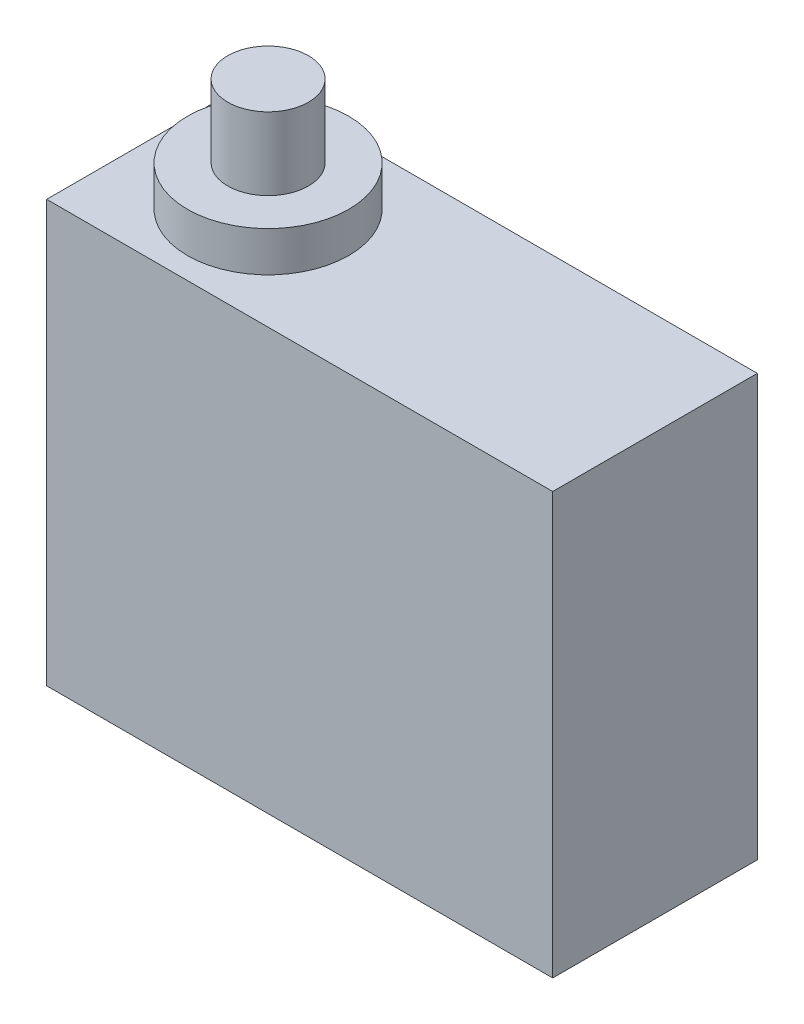
ISO-10303-21;
HEADER;
FILE_DESCRIPTION(('STEP AP214'),'2;1');
FILE_NAME('part.step','',(''),(''),'','','');
FILE_SCHEMA(('AUTOMOTIVE_DESIGN { 1 0 10303 214 1 1 1 1 }'));
ENDSEC;
DATA;
#1=APPLICATION_CONTEXT('core data for automotive mechanical design processes');
#2=APPLICATION_PROTOCOL_DEFINITION('international standard','automotive_design',2000,#1);
#3=PRODUCT_CONTEXT('',#1,'mechanical');
#4=PRODUCT('Part','Part','',(#3));
#5=PRODUCT_RELATED_PRODUCT_CATEGORY('part','',(#4));
#6=PRODUCT_DEFINITION_FORMATION('','',#4);
#7=PRODUCT_DEFINITION_CONTEXT('part definition',#1,'design');
#8=PRODUCT_DEFINITION('design','',#6,#7);
#9=PRODUCT_DEFINITION_SHAPE('','',#8);
#10=(LENGTH_UNIT() NAMED_UNIT(*) SI_UNIT(.MILLI.,.METRE.));
#11=(NAMED_UNIT(*) PLANE_ANGLE_UNIT() SI_UNIT($,.RADIAN.));
#12=(NAMED_UNIT(*) SI_UNIT($,.STERADIAN.) SOLID_ANGLE_UNIT());
#13=UNCERTAINTY_MEASURE_WITH_UNIT(LENGTH_MEASURE(1.E-05),#10,'distance_accuracy_value','');
#14=(GEOMETRIC_REPRESENTATION_CONTEXT(3) GLOBAL_UNCERTAINTY_ASSIGNED_CONTEXT((#13)) GLOBAL_UNIT_ASSIGNED_CONTEXT((#10,
#11,#12)) REPRESENTATION_CONTEXT('',''));
#15=CARTESIAN_POINT('',(0.,0.,0.));
#16=DIRECTION('',(0.,0.,1.));
#17=DIRECTION('',(1.,0.,0.));
#18=AXIS2_PLACEMENT_3D('',#15,#16,#17);
#19=CARTESIAN_POINT('',(-9.41,-7.835,3.805));
#20=DIRECTION('',(1.,0.,0.));
#21=DIRECTION('',(0.,0.,-1.));
#22=AXIS2_PLACEMENT_3D('',#19,#20,#21);
#23=PLANE('',#22);
#24=DIRECTION('',(0.,-1.,0.));
#25=VECTOR('',#24,1.);
#26=CARTESIAN_POINT('',(-9.41,-7.835,-3.805));
#27=LINE('',#26,#25);
#28=CARTESIAN_POINT('',(-9.41,7.835,-3.805));
#29=VERTEX_POINT('',#28);
#30=CARTESIAN_POINT('',(-9.41,-7.835,-3.805));
#31=VERTEX_POINT('',#30);
#32=EDGE_CURVE('E112',#29,#31,#27,.T.);
#33=ORIENTED_EDGE('',*,*,#32,.T.);
#34=DIRECTION('',(0.,0.,-1.));
#35=VECTOR('',#34,1.);
#36=CARTESIAN_POINT('',(-9.41,-7.835,3.805));
#37=LINE('',#36,#35);
#38=CARTESIAN_POINT('',(-9.41,-7.835,3.805));
#39=VERTEX_POINT('',#38);
#40=EDGE_CURVE('E101',#39,#31,#37,.T.);
#41=ORIENTED_EDGE('',*,*,#40,.F.);
#42=DIRECTION('',(0.,-1.,0.));
#43=VECTOR('',#42,1.);
#44=CARTESIAN_POINT('',(-9.41,-7.835,3.805));
#45=LINE('',#44,#43);
#46=CARTESIAN_POINT('',(-9.41,7.835,3.805));
#47=VERTEX_POINT('',#46);
#48=EDGE_CURVE('E93',#47,#39,#45,.T.);
#49=ORIENTED_EDGE('',*,*,#48,.F.);
#50=DIRECTION('',(0.,0.,-1.));
#51=VECTOR('',#50,1.);
#52=CARTESIAN_POINT('',(-9.41,7.835,3.805));
#53=LINE('',#52,#51);
#54=EDGE_CURVE('E108',#47,#29,#53,.T.);
#55=ORIENTED_EDGE('',*,*,#54,.T.);
#56=EDGE_LOOP('',(#33,#41,#49,#55));
#57=FACE_BOUND('',#56,.T.);
#58=ADVANCED_FACE('F39',(#57),#23,.F.);
#59=CARTESIAN_POINT('',(9.41,-7.83499999999999,3.805));
#60=DIRECTION('',(0.,1.,0.));
#61=DIRECTION('',(-1.,0.,0.));
#62=AXIS2_PLACEMENT_3D('',#59,#60,#61);
#63=PLANE('',#62);
#64=DIRECTION('',(1.,0.,0.));
#65=VECTOR('',#64,1.);
#66=CARTESIAN_POINT('',(9.41,-7.83499999999999,-3.805));
#67=LINE('',#66,#65);
#68=CARTESIAN_POINT('',(9.41,-7.83499999999999,-3.805));
#69=VERTEX_POINT('',#68);
#70=EDGE_CURVE('E99',#31,#69,#67,.T.);
#71=ORIENTED_EDGE('',*,*,#70,.T.);
#72=DIRECTION('',(0.,0.,-1.));
#73=VECTOR('',#72,1.);
#74=CARTESIAN_POINT('',(9.41,-7.83499999999999,3.805));
#75=LINE('',#74,#73);
#76=CARTESIAN_POINT('',(9.41,-7.83499999999999,3.805));
#77=VERTEX_POINT('',#76);
#78=EDGE_CURVE('E97',#77,#69,#75,.T.);
#79=ORIENTED_EDGE('',*,*,#78,.F.);
#80=DIRECTION('',(1.,0.,0.));
#81=VECTOR('',#80,1.);
#82=CARTESIAN_POINT('',(9.41,-7.83499999999999,3.805));
#83=LINE('',#82,#81);
#84=EDGE_CURVE('E88',#39,#77,#83,.T.);
#85=ORIENTED_EDGE('',*,*,#84,.F.);
#86=ORIENTED_EDGE('',*,*,#40,.T.);
#87=EDGE_LOOP('',(#71,#79,#85,#86));
#88=FACE_BOUND('',#87,.T.);
#89=ADVANCED_FACE('F98',(#88),#63,.F.);
#90=CARTESIAN_POINT('',(9.41,-7.83499999999999,3.805));
#91=DIRECTION('',(-1.,0.,0.));
#92=DIRECTION('',(0.,0.,1.));
#93=AXIS2_PLACEMENT_3D('',#90,#91,#92);
#94=PLANE('',#93);
#95=DIRECTION('',(0.,1.,0.));
#96=VECTOR('',#95,1.);
#97=CARTESIAN_POINT('',(9.41,-7.83499999999999,-3.805));
#98=LINE('',#97,#96);
#99=CARTESIAN_POINT('',(9.41,7.83500000000001,-3.805));
#100=VERTEX_POINT('',#99);
#101=EDGE_CURVE('E74',#69,#100,#98,.T.);
#102=ORIENTED_EDGE('',*,*,#101,.T.);
#103=DIRECTION('',(0.,0.,-1.));
#104=VECTOR('',#103,1.);
#105=CARTESIAN_POINT('',(9.41,7.83500000000001,3.805));
#106=LINE('',#105,#104);
#107=CARTESIAN_POINT('',(9.41,7.83500000000001,3.805));
#108=VERTEX_POINT('',#107);
#109=EDGE_CURVE('E102',#108,#100,#106,.T.);
#110=ORIENTED_EDGE('',*,*,#109,.F.);
#111=DIRECTION('',(0.,1.,0.));
#112=VECTOR('',#111,1.);
#113=CARTESIAN_POINT('',(9.41,-7.83499999999999,3.805));
#114=LINE('',#113,#112);
#115=EDGE_CURVE('E91',#77,#108,#114,.T.);
#116=ORIENTED_EDGE('',*,*,#115,.F.);
#117=ORIENTED_EDGE('',*,*,#78,.T.);
#118=EDGE_LOOP('',(#102,#110,#116,#117));
#119=FACE_BOUND('',#118,.T.);
#120=ADVANCED_FACE('F104',(#119),#94,.F.);
#121=CARTESIAN_POINT('',(9.41,7.83500000000001,3.805));
#122=DIRECTION('',(0.,-1.,0.));
#123=DIRECTION('',(1.,0.,0.));
#124=AXIS2_PLACEMENT_3D('',#121,#122,#123);
#125=PLANE('',#124);
#126=CARTESIAN_POINT('',(-4.98,7.835,0.));
#127=DIRECTION('',(0.,-1.,0.));
#128=DIRECTION('',(1.,0.,0.));
#129=AXIS2_PLACEMENT_3D('',#126,#127,#128);
#130=CIRCLE('',#129,3.);
#131=CARTESIAN_POINT('',(-1.98,7.835,0.));
#132=VERTEX_POINT('',#131);
#133=EDGE_CURVE('E42',#132,#132,#130,.F.);
#134=ORIENTED_EDGE('',*,*,#133,.F.);
#135=EDGE_LOOP('',(#134));
#136=FACE_BOUND('',#135,.T.);
#137=DIRECTION('',(-1.,0.,0.));
#138=VECTOR('',#137,1.);
#139=CARTESIAN_POINT('',(9.41,7.83500000000001,-3.805));
#140=LINE('',#139,#138);
#141=EDGE_CURVE('E80',#100,#29,#140,.T.);
#142=ORIENTED_EDGE('',*,*,#141,.T.);
#143=ORIENTED_EDGE('',*,*,#54,.F.);
#144=DIRECTION('',(-1.,0.,0.));
#145=VECTOR('',#144,1.);
#146=CARTESIAN_POINT('',(9.41,7.83500000000001,3.805));
#147=LINE('',#146,#145);
#148=EDGE_CURVE('E57',#108,#47,#147,.T.);
#149=ORIENTED_EDGE('',*,*,#148,.F.);
#150=ORIENTED_EDGE('',*,*,#109,.T.);
#151=EDGE_LOOP('',(#142,#143,#149,#150));
#152=FACE_BOUND('',#151,.T.);
#153=ADVANCED_FACE('F133',(#136,#152),#125,.F.);
#154=CARTESIAN_POINT('',(0.,0.,3.805));
#155=DIRECTION('',(0.,0.,1.));
#156=DIRECTION('',(1.,0.,0.));
#157=AXIS2_PLACEMENT_3D('',#154,#155,#156);
#158=PLANE('',#157);
#159=ORIENTED_EDGE('',*,*,#48,.T.);
#160=ORIENTED_EDGE('',*,*,#84,.T.);
#161=ORIENTED_EDGE('',*,*,#115,.T.);
#162=ORIENTED_EDGE('',*,*,#148,.T.);
#163=EDGE_LOOP('',(#159,#160,#161,#162));
#164=FACE_BOUND('',#163,.T.);
#165=ADVANCED_FACE('F89',(#164),#158,.T.);
#166=CARTESIAN_POINT('',(0.,0.,-3.805));
#167=DIRECTION('',(0.,0.,1.));
#168=DIRECTION('',(1.,0.,0.));
#169=AXIS2_PLACEMENT_3D('',#166,#167,#168);
#170=PLANE('',#169);
#171=ORIENTED_EDGE('',*,*,#32,.F.);
#172=ORIENTED_EDGE('',*,*,#141,.F.);
#173=ORIENTED_EDGE('',*,*,#101,.F.);
#174=ORIENTED_EDGE('',*,*,#70,.F.);
#175=EDGE_LOOP('',(#171,#172,#173,#174));
#176=FACE_BOUND('',#175,.T.);
#177=ADVANCED_FACE('F140',(#176),#170,.F.);
#178=CARTESIAN_POINT('',(-4.98,9.325,0.));
#179=DIRECTION('',(0.,-1.,0.));
#180=DIRECTION('',(1.,0.,0.));
#181=AXIS2_PLACEMENT_3D('',#178,#179,#180);
#182=CYLINDRICAL_SURFACE('',#181,3.);
#183=CARTESIAN_POINT('',(-4.98,9.325,0.));
#184=DIRECTION('',(0.,1.,0.));
#185=DIRECTION('',(-1.,0.,0.));
#186=AXIS2_PLACEMENT_3D('',#183,#184,#185);
#187=CIRCLE('',#186,3.);
#188=CARTESIAN_POINT('',(-7.98,9.325,0.));
#189=VERTEX_POINT('',#188);
#190=EDGE_CURVE('E116',#189,#189,#187,.T.);
#191=ORIENTED_EDGE('',*,*,#190,.F.);
#192=EDGE_LOOP('',(#191));
#193=FACE_BOUND('',#192,.T.);
#194=ORIENTED_EDGE('',*,*,#133,.T.);
#195=EDGE_LOOP('',(#194));
#196=FACE_BOUND('',#195,.T.);
#197=ADVANCED_FACE('F131',(#193,#196),#182,.T.);
#198=CARTESIAN_POINT('',(-4.98,9.325,0.));
#199=DIRECTION('',(0.,1.,0.));
#200=DIRECTION('',(-1.,0.,0.));
#201=AXIS2_PLACEMENT_3D('',#198,#199,#200);
#202=PLANE('',#201);
#203=CARTESIAN_POINT('',(-4.98,9.325,0.));
#204=DIRECTION('',(0.,1.,0.));
#205=DIRECTION('',(-1.,0.,0.));
#206=AXIS2_PLACEMENT_3D('',#203,#204,#205);
#207=CIRCLE('',#206,1.5);
#208=CARTESIAN_POINT('',(-3.48,9.325,0.));
#209=VERTEX_POINT('',#208);
#210=EDGE_CURVE('E11',#209,#209,#207,.T.);
#211=ORIENTED_EDGE('',*,*,#210,.F.);
#212=EDGE_LOOP('',(#211));
#213=FACE_BOUND('',#212,.T.);
#214=ORIENTED_EDGE('',*,*,#190,.T.);
#215=EDGE_LOOP('',(#214));
#216=FACE_BOUND('',#215,.T.);
#217=ADVANCED_FACE('F155',(#213,#216),#202,.T.);
#218=CARTESIAN_POINT('',(-4.98,12.025,0.));
#219=DIRECTION('',(0.,-1.,0.));
#220=DIRECTION('',(1.,0.,0.));
#221=AXIS2_PLACEMENT_3D('',#218,#219,#220);
#222=CYLINDRICAL_SURFACE('',#221,1.5);
#223=CARTESIAN_POINT('',(-4.98,12.025,0.));
#224=DIRECTION('',(0.,1.,0.));
#225=DIRECTION('',(-1.,0.,0.));
#226=AXIS2_PLACEMENT_3D('',#223,#224,#225);
#227=CIRCLE('',#226,1.5);
#228=CARTESIAN_POINT('',(-3.48,12.025,0.));
#229=VERTEX_POINT('',#228);
#230=EDGE_CURVE('E173',#229,#229,#227,.T.);
#231=CARTESIAN_POINT('',(-3.48,12.025,0.));
#232=CARTESIAN_POINT('',(-3.48,11.996875,0.));
#233=CARTESIAN_POINT('',(-3.48,11.96875,0.));
#234=CARTESIAN_POINT('',(-3.48,11.9125,0.));
#235=CARTESIAN_POINT('',(-3.48,11.884375,0.));
#236=CARTESIAN_POINT('',(-3.48,11.828125,0.));
#237=CARTESIAN_POINT('',(-3.48,11.8,0.));
#238=CARTESIAN_POINT('',(-3.48,11.74375,0.));
#239=CARTESIAN_POINT('',(-3.48,11.715625,0.));
#240=CARTESIAN_POINT('',(-3.48,11.659375,0.));
#241=CARTESIAN_POINT('',(-3.48,11.63125,0.));
#242=CARTESIAN_POINT('',(-3.48,11.575,0.));
#243=CARTESIAN_POINT('',(-3.48,11.546875,0.));
#244=CARTESIAN_POINT('',(-3.48,11.490625,0.));
#245=CARTESIAN_POINT('',(-3.48,11.4625,0.));
#246=CARTESIAN_POINT('',(-3.48,11.40625,0.));
#247=CARTESIAN_POINT('',(-3.48,11.378125,0.));
#248=CARTESIAN_POINT('',(-3.48,11.321875,0.));
#249=CARTESIAN_POINT('',(-3.48,11.29375,0.));
#250=CARTESIAN_POINT('',(-3.48,11.2375,0.));
#251=CARTESIAN_POINT('',(-3.48,11.209375,0.));
#252=CARTESIAN_POINT('',(-3.48,11.153125,0.));
#253=CARTESIAN_POINT('',(-3.48,11.125,0.));
#254=CARTESIAN_POINT('',(-3.48,11.06875,0.));
#255=CARTESIAN_POINT('',(-3.48,11.040625,0.));
#256=CARTESIAN_POINT('',(-3.48,10.984375,0.));
#257=CARTESIAN_POINT('',(-3.48,10.95625,0.));
#258=CARTESIAN_POINT('',(-3.48,10.9,0.));
#259=CARTESIAN_POINT('',(-3.48,10.871875,0.));
#260=CARTESIAN_POINT('',(-3.48,10.815625,0.));
#261=CARTESIAN_POINT('',(-3.48,10.7875,0.));
#262=CARTESIAN_POINT('',(-3.48,10.73125,0.));
#263=CARTESIAN_POINT('',(-3.48,10.703125,0.));
#264=CARTESIAN_POINT('',(-3.48,10.646875,0.));
#265=CARTESIAN_POINT('',(-3.48,10.61875,0.));
#266=CARTESIAN_POINT('',(-3.48,10.5625,0.));
#267=CARTESIAN_POINT('',(-3.48,10.534375,0.));
#268=CARTESIAN_POINT('',(-3.48,10.478125,0.));
#269=CARTESIAN_POINT('',(-3.48,10.45,0.));
#270=CARTESIAN_POINT('',(-3.48,10.39375,0.));
#271=CARTESIAN_POINT('',(-3.48,10.365625,0.));
#272=CARTESIAN_POINT('',(-3.48,10.309375,0.));
#273=CARTESIAN_POINT('',(-3.48,10.28125,0.));
#274=CARTESIAN_POINT('',(-3.48,10.225,0.));
#275=CARTESIAN_POINT('',(-3.48,10.196875,0.));
#276=CARTESIAN_POINT('',(-3.48,10.140625,0.));
#277=CARTESIAN_POINT('',(-3.48,10.1125,0.));
#278=CARTESIAN_POINT('',(-3.48,10.05625,0.));
#279=CARTESIAN_POINT('',(-3.48,10.028125,0.));
#280=CARTESIAN_POINT('',(-3.48,9.971875,0.));
#281=CARTESIAN_POINT('',(-3.48,9.94375,0.));
#282=CARTESIAN_POINT('',(-3.48,9.8875,0.));
#283=CARTESIAN_POINT('',(-3.48,9.859375,0.));
#284=CARTESIAN_POINT('',(-3.48,9.803125,0.));
#285=CARTESIAN_POINT('',(-3.48,9.775,0.));
#286=CARTESIAN_POINT('',(-3.48,9.71875,0.));
#287=CARTESIAN_POINT('',(-3.48,9.690625,0.));
#288=CARTESIAN_POINT('',(-3.48,9.634375,0.));
#289=CARTESIAN_POINT('',(-3.48,9.60625,0.));
#290=CARTESIAN_POINT('',(-3.48,9.55,0.));
#291=CARTESIAN_POINT('',(-3.48,9.521875,0.));
#292=CARTESIAN_POINT('',(-3.48,9.465625,0.));
#293=CARTESIAN_POINT('',(-3.48,9.4375,0.));
#294=CARTESIAN_POINT('',(-3.48,9.38125,0.));
#295=CARTESIAN_POINT('',(-3.48,9.353125,0.));
#296=CARTESIAN_POINT('',(-3.48,9.325,0.));
#297=B_SPLINE_CURVE_WITH_KNOTS('',3,(#231,#232,#233,#234,#235,#236,#237,#238,#239,#240,#241,
#242,#243,#244,#245,#246,#247,#248,#249,#250,#251,#252,#253,#254,#255,#256,#257,#258,#259,#260,
#261,#262,#263,#264,#265,#266,#267,#268,#269,#270,#271,#272,#273,#274,#275,#276,#277,#278,#279,
#280,#281,#282,#283,#284,#285,#286,#287,#288,#289,#290,#291,#292,#293,#294,#295,#296),
.UNSPECIFIED.,.F.,.F.,(4,2,2,2,2,2,2,2,2,2,2,2,2,2,2,2,2,2,2,2,2,2,2,2,2,2,2,2,2,2,2,2,4),(0.,
0.0843749999999994,0.168749999999999,0.253125,0.337499999999999,0.421874999999999,0.50625,
0.590624999999999,0.674999999999998,0.759375,0.843749999999999,0.928124999999998,1.0125,
1.096875,1.18125,1.265625,1.35,1.434375,1.51875,1.603125,1.6875,1.771875,1.85625,1.940625,2.025,
2.109375,2.19375,2.278125,2.3625,2.446875,2.53125,2.615625,2.7),.UNSPECIFIED.);
#298=EDGE_CURVE('BSEAM161',#229,#209,#297,.T.);
#299=ORIENTED_EDGE('',*,*,#230,.F.);
#300=ORIENTED_EDGE('',*,*,#210,.T.);
#301=ORIENTED_EDGE('',*,*,#298,.T.);
#302=ORIENTED_EDGE('',*,*,#298,.F.);
#303=EDGE_LOOP('',(#299,#301,#300,#302));
#304=FACE_BOUND('',#303,.T.);
#305=ADVANCED_FACE('F161',(#304),#222,.T.);
#306=CARTESIAN_POINT('',(-4.98,12.025,0.));
#307=DIRECTION('',(0.,1.,0.));
#308=DIRECTION('',(-1.,0.,0.));
#309=AXIS2_PLACEMENT_3D('',#306,#307,#308);
#310=PLANE('',#309);
#311=ORIENTED_EDGE('',*,*,#230,.T.);
#312=EDGE_LOOP('',(#311));
#313=FACE_BOUND('',#312,.T.);
#314=ADVANCED_FACE('F165',(#313),#310,.T.);
#315=CLOSED_SHELL('',(#58,#89,#120,#153,#165,#177,#197,#217,#305,#314));
#316=MANIFOLD_SOLID_BREP('B2',#315);
#317=ADVANCED_BREP_SHAPE_REPRESENTATION('',(#18,#316),#14);
#318=SHAPE_DEFINITION_REPRESENTATION(#9,#317);
ENDSEC;
END-ISO-10303-21;
